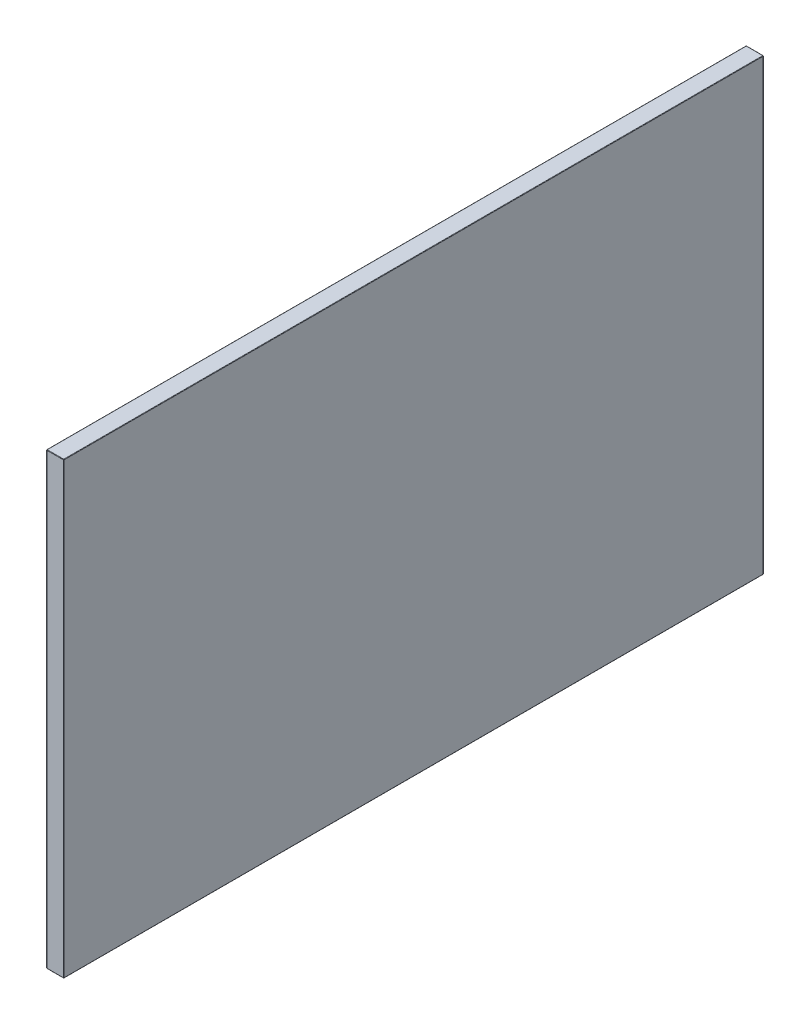
ISO-10303-21;
HEADER;
FILE_DESCRIPTION(('STEP AP214'),'2;1');
FILE_NAME('part.step','',(''),(''),'','','');
FILE_SCHEMA(('AUTOMOTIVE_DESIGN { 1 0 10303 214 1 1 1 1 }'));
ENDSEC;
DATA;
#1=APPLICATION_CONTEXT('core data for automotive mechanical design processes');
#2=APPLICATION_PROTOCOL_DEFINITION('international standard','automotive_design',2000,#1);
#3=PRODUCT_CONTEXT('',#1,'mechanical');
#4=PRODUCT('Part','Part','',(#3));
#5=PRODUCT_RELATED_PRODUCT_CATEGORY('part','',(#4));
#6=PRODUCT_DEFINITION_FORMATION('','',#4);
#7=PRODUCT_DEFINITION_CONTEXT('part definition',#1,'design');
#8=PRODUCT_DEFINITION('design','',#6,#7);
#9=PRODUCT_DEFINITION_SHAPE('','',#8);
#10=(LENGTH_UNIT() NAMED_UNIT(*) SI_UNIT(.MILLI.,.METRE.));
#11=(NAMED_UNIT(*) PLANE_ANGLE_UNIT() SI_UNIT($,.RADIAN.));
#12=(NAMED_UNIT(*) SI_UNIT($,.STERADIAN.) SOLID_ANGLE_UNIT());
#13=UNCERTAINTY_MEASURE_WITH_UNIT(LENGTH_MEASURE(1.E-05),#10,'distance_accuracy_value','');
#14=(GEOMETRIC_REPRESENTATION_CONTEXT(3) GLOBAL_UNCERTAINTY_ASSIGNED_CONTEXT((#13)) GLOBAL_UNIT_ASSIGNED_CONTEXT((#10,
#11,#12)) REPRESENTATION_CONTEXT('',''));
#15=CARTESIAN_POINT('',(0.,0.,0.));
#16=DIRECTION('',(0.,0.,1.));
#17=DIRECTION('',(1.,0.,0.));
#18=AXIS2_PLACEMENT_3D('',#15,#16,#17);
#19=CARTESIAN_POINT('',(20.,260.,405.));
#20=DIRECTION('',(0.,1.,0.));
#21=DIRECTION('',(0.,0.,1.));
#22=AXIS2_PLACEMENT_3D('',#19,#20,#21);
#23=PLANE('',#22);
#24=DIRECTION('',(0.,0.,-1.));
#25=VECTOR('',#24,1.);
#26=CARTESIAN_POINT('',(19.5,260.,-405.));
#27=LINE('',#26,#25);
#28=CARTESIAN_POINT('',(19.5,260.,404.5));
#29=VERTEX_POINT('',#28);
#30=CARTESIAN_POINT('',(19.5,260.,-404.5));
#31=VERTEX_POINT('',#30);
#32=EDGE_CURVE('E43',#29,#31,#27,.T.);
#33=ORIENTED_EDGE('',*,*,#32,.T.);
#34=DIRECTION('',(-1.,0.,0.));
#35=VECTOR('',#34,1.);
#36=CARTESIAN_POINT('',(20.,260.,-404.5));
#37=LINE('',#36,#35);
#38=CARTESIAN_POINT('',(0.5,260.,-404.5));
#39=VERTEX_POINT('',#38);
#40=EDGE_CURVE('E11',#31,#39,#37,.T.);
#41=ORIENTED_EDGE('',*,*,#40,.T.);
#42=DIRECTION('',(0.,0.,-1.));
#43=VECTOR('',#42,1.);
#44=CARTESIAN_POINT('',(0.5,260.,405.));
#45=LINE('',#44,#43);
#46=CARTESIAN_POINT('',(0.5,260.,404.5));
#47=VERTEX_POINT('',#46);
#48=EDGE_CURVE('E200',#39,#47,#45,.F.);
#49=ORIENTED_EDGE('',*,*,#48,.T.);
#50=DIRECTION('',(-1.,0.,0.));
#51=VECTOR('',#50,1.);
#52=CARTESIAN_POINT('',(20.,260.,404.5));
#53=LINE('',#52,#51);
#54=EDGE_CURVE('E54',#47,#29,#53,.F.);
#55=ORIENTED_EDGE('',*,*,#54,.T.);
#56=EDGE_LOOP('',(#33,#41,#49,#55));
#57=FACE_BOUND('',#56,.T.);
#58=ADVANCED_FACE('F34',(#57),#23,.T.);
#59=CARTESIAN_POINT('',(20.,260.,405.));
#60=DIRECTION('',(0.,0.,-1.));
#61=DIRECTION('',(-1.,0.,0.));
#62=AXIS2_PLACEMENT_3D('',#59,#60,#61);
#63=PLANE('',#62);
#64=DIRECTION('',(-1.,0.,0.));
#65=VECTOR('',#64,1.);
#66=CARTESIAN_POINT('',(20.,-259.5,405.));
#67=LINE('',#66,#65);
#68=CARTESIAN_POINT('',(0.5,-259.5,405.));
#69=VERTEX_POINT('',#68);
#70=CARTESIAN_POINT('',(19.5,-259.5,405.));
#71=VERTEX_POINT('',#70);
#72=EDGE_CURVE('E195',#69,#71,#67,.F.);
#73=ORIENTED_EDGE('',*,*,#72,.T.);
#74=DIRECTION('',(0.,-1.,0.));
#75=VECTOR('',#74,1.);
#76=CARTESIAN_POINT('',(19.5,260.,405.));
#77=LINE('',#76,#75);
#78=CARTESIAN_POINT('',(19.5,259.5,405.));
#79=VERTEX_POINT('',#78);
#80=EDGE_CURVE('E197',#71,#79,#77,.F.);
#81=ORIENTED_EDGE('',*,*,#80,.T.);
#82=DIRECTION('',(-1.,0.,0.));
#83=VECTOR('',#82,1.);
#84=CARTESIAN_POINT('',(0.,259.5,405.));
#85=LINE('',#84,#83);
#86=CARTESIAN_POINT('',(0.5,259.5,405.));
#87=VERTEX_POINT('',#86);
#88=EDGE_CURVE('E191',#79,#87,#85,.T.);
#89=ORIENTED_EDGE('',*,*,#88,.T.);
#90=DIRECTION('',(0.,-1.,0.));
#91=VECTOR('',#90,1.);
#92=CARTESIAN_POINT('',(0.5,-260.,405.));
#93=LINE('',#92,#91);
#94=EDGE_CURVE('E193',#87,#69,#93,.T.);
#95=ORIENTED_EDGE('',*,*,#94,.T.);
#96=EDGE_LOOP('',(#73,#81,#89,#95));
#97=FACE_BOUND('',#96,.T.);
#98=ADVANCED_FACE('F276',(#97),#63,.F.);
#99=CARTESIAN_POINT('',(20.,-260.,405.));
#100=DIRECTION('',(0.,1.,0.));
#101=DIRECTION('',(0.,0.,1.));
#102=AXIS2_PLACEMENT_3D('',#99,#100,#101);
#103=PLANE('',#102);
#104=DIRECTION('',(-1.,0.,0.));
#105=VECTOR('',#104,1.);
#106=CARTESIAN_POINT('',(20.,-260.,-404.5));
#107=LINE('',#106,#105);
#108=CARTESIAN_POINT('',(0.5,-260.,-404.5));
#109=VERTEX_POINT('',#108);
#110=CARTESIAN_POINT('',(19.5,-260.,-404.5));
#111=VERTEX_POINT('',#110);
#112=EDGE_CURVE('E186',#109,#111,#107,.F.);
#113=ORIENTED_EDGE('',*,*,#112,.T.);
#114=DIRECTION('',(0.,0.,-1.));
#115=VECTOR('',#114,1.);
#116=CARTESIAN_POINT('',(19.5,-260.,405.));
#117=LINE('',#116,#115);
#118=CARTESIAN_POINT('',(19.5,-260.,404.5));
#119=VERTEX_POINT('',#118);
#120=EDGE_CURVE('E188',#111,#119,#117,.F.);
#121=ORIENTED_EDGE('',*,*,#120,.T.);
#122=DIRECTION('',(-1.,0.,0.));
#123=VECTOR('',#122,1.);
#124=CARTESIAN_POINT('',(20.,-260.,404.5));
#125=LINE('',#124,#123);
#126=CARTESIAN_POINT('',(0.5,-260.,404.5));
#127=VERTEX_POINT('',#126);
#128=EDGE_CURVE('E182',#119,#127,#125,.T.);
#129=ORIENTED_EDGE('',*,*,#128,.T.);
#130=DIRECTION('',(0.,0.,-1.));
#131=VECTOR('',#130,1.);
#132=CARTESIAN_POINT('',(0.5,-260.,-405.));
#133=LINE('',#132,#131);
#134=EDGE_CURVE('E184',#127,#109,#133,.T.);
#135=ORIENTED_EDGE('',*,*,#134,.T.);
#136=EDGE_LOOP('',(#113,#121,#129,#135));
#137=FACE_BOUND('',#136,.T.);
#138=ADVANCED_FACE('F267',(#137),#103,.F.);
#139=CARTESIAN_POINT('',(20.,260.,-405.));
#140=DIRECTION('',(0.,0.,-1.));
#141=DIRECTION('',(-1.,0.,0.));
#142=AXIS2_PLACEMENT_3D('',#139,#140,#141);
#143=PLANE('',#142);
#144=DIRECTION('',(0.,-1.,0.));
#145=VECTOR('',#144,1.);
#146=CARTESIAN_POINT('',(19.5,-260.,-405.));
#147=LINE('',#146,#145);
#148=CARTESIAN_POINT('',(19.5,259.5,-405.));
#149=VERTEX_POINT('',#148);
#150=CARTESIAN_POINT('',(19.5,-259.5,-405.));
#151=VERTEX_POINT('',#150);
#152=EDGE_CURVE('E134',#149,#151,#147,.T.);
#153=ORIENTED_EDGE('',*,*,#152,.T.);
#154=DIRECTION('',(-1.,0.,0.));
#155=VECTOR('',#154,1.);
#156=CARTESIAN_POINT('',(0.,-259.5,-405.));
#157=LINE('',#156,#155);
#158=CARTESIAN_POINT('',(0.5,-259.5,-405.));
#159=VERTEX_POINT('',#158);
#160=EDGE_CURVE('E130',#151,#159,#157,.T.);
#161=ORIENTED_EDGE('',*,*,#160,.T.);
#162=DIRECTION('',(0.,-1.,0.));
#163=VECTOR('',#162,1.);
#164=CARTESIAN_POINT('',(0.5,260.,-405.));
#165=LINE('',#164,#163);
#166=CARTESIAN_POINT('',(0.5,259.5,-405.));
#167=VERTEX_POINT('',#166);
#168=EDGE_CURVE('E122',#159,#167,#165,.F.);
#169=ORIENTED_EDGE('',*,*,#168,.T.);
#170=DIRECTION('',(-1.,0.,0.));
#171=VECTOR('',#170,1.);
#172=CARTESIAN_POINT('',(20.,259.5,-405.));
#173=LINE('',#172,#171);
#174=EDGE_CURVE('E127',#167,#149,#173,.F.);
#175=ORIENTED_EDGE('',*,*,#174,.T.);
#176=EDGE_LOOP('',(#153,#161,#169,#175));
#177=FACE_BOUND('',#176,.T.);
#178=ADVANCED_FACE('F125',(#177),#143,.T.);
#179=CARTESIAN_POINT('',(20.,0.,0.));
#180=DIRECTION('',(-1.,0.,0.));
#181=DIRECTION('',(0.,0.,1.));
#182=AXIS2_PLACEMENT_3D('',#179,#180,#181);
#183=PLANE('',#182);
#184=DIRECTION('',(0.,0.,-1.));
#185=VECTOR('',#184,1.);
#186=CARTESIAN_POINT('',(20.,-259.5,0.));
#187=LINE('',#186,#185);
#188=CARTESIAN_POINT('',(20.,-259.5,404.5));
#189=VERTEX_POINT('',#188);
#190=CARTESIAN_POINT('',(20.,-259.5,-404.5));
#191=VERTEX_POINT('',#190);
#192=EDGE_CURVE('E170',#189,#191,#187,.T.);
#193=ORIENTED_EDGE('',*,*,#192,.T.);
#194=DIRECTION('',(0.,-1.,0.));
#195=VECTOR('',#194,1.);
#196=CARTESIAN_POINT('',(20.,260.,-404.5));
#197=LINE('',#196,#195);
#198=CARTESIAN_POINT('',(20.,259.5,-404.5));
#199=VERTEX_POINT('',#198);
#200=EDGE_CURVE('E172',#191,#199,#197,.F.);
#201=ORIENTED_EDGE('',*,*,#200,.T.);
#202=DIRECTION('',(0.,0.,-1.));
#203=VECTOR('',#202,1.);
#204=CARTESIAN_POINT('',(20.,259.5,405.));
#205=LINE('',#204,#203);
#206=CARTESIAN_POINT('',(20.,259.5,404.5));
#207=VERTEX_POINT('',#206);
#208=EDGE_CURVE('E166',#199,#207,#205,.F.);
#209=ORIENTED_EDGE('',*,*,#208,.T.);
#210=DIRECTION('',(0.,-1.,0.));
#211=VECTOR('',#210,1.);
#212=CARTESIAN_POINT('',(20.,0.,404.5));
#213=LINE('',#212,#211);
#214=EDGE_CURVE('E168',#207,#189,#213,.T.);
#215=ORIENTED_EDGE('',*,*,#214,.T.);
#216=EDGE_LOOP('',(#193,#201,#209,#215));
#217=FACE_BOUND('',#216,.T.);
#218=ADVANCED_FACE('F299',(#217),#183,.F.);
#219=CARTESIAN_POINT('',(0.,0.,0.));
#220=DIRECTION('',(-1.,0.,0.));
#221=DIRECTION('',(0.,0.,1.));
#222=AXIS2_PLACEMENT_3D('',#219,#220,#221);
#223=PLANE('',#222);
#224=DIRECTION('',(0.,0.,-1.));
#225=VECTOR('',#224,1.);
#226=CARTESIAN_POINT('',(0.,259.5,0.));
#227=LINE('',#226,#225);
#228=CARTESIAN_POINT('',(0.,259.5,404.5));
#229=VERTEX_POINT('',#228);
#230=CARTESIAN_POINT('',(0.,259.5,-404.5));
#231=VERTEX_POINT('',#230);
#232=EDGE_CURVE('E175',#229,#231,#227,.T.);
#233=ORIENTED_EDGE('',*,*,#232,.T.);
#234=DIRECTION('',(0.,-1.,0.));
#235=VECTOR('',#234,1.);
#236=CARTESIAN_POINT('',(0.,0.,-404.5));
#237=LINE('',#236,#235);
#238=CARTESIAN_POINT('',(0.,-259.5,-404.5));
#239=VERTEX_POINT('',#238);
#240=EDGE_CURVE('E142',#231,#239,#237,.T.);
#241=ORIENTED_EDGE('',*,*,#240,.T.);
#242=DIRECTION('',(0.,0.,-1.));
#243=VECTOR('',#242,1.);
#244=CARTESIAN_POINT('',(0.,-259.5,405.));
#245=LINE('',#244,#243);
#246=CARTESIAN_POINT('',(0.,-259.5,404.5));
#247=VERTEX_POINT('',#246);
#248=EDGE_CURVE('E179',#239,#247,#245,.F.);
#249=ORIENTED_EDGE('',*,*,#248,.T.);
#250=DIRECTION('',(0.,-1.,0.));
#251=VECTOR('',#250,1.);
#252=CARTESIAN_POINT('',(0.,260.,404.5));
#253=LINE('',#252,#251);
#254=EDGE_CURVE('E177',#247,#229,#253,.F.);
#255=ORIENTED_EDGE('',*,*,#254,.T.);
#256=EDGE_LOOP('',(#233,#241,#249,#255));
#257=FACE_BOUND('',#256,.T.);
#258=ADVANCED_FACE('F297',(#257),#223,.T.);
#259=CARTESIAN_POINT('',(0.5,260.,404.5));
#260=DIRECTION('',(0.,1.,0.));
#261=DIRECTION('',(0.,0.,1.));
#262=AXIS2_PLACEMENT_3D('',#259,#260,#261);
#263=CYLINDRICAL_SURFACE('',#262,0.5);
#264=CARTESIAN_POINT('',(0.5,259.5,404.5));
#265=DIRECTION('',(0.,1.,0.));
#266=DIRECTION('',(0.,0.,1.));
#267=AXIS2_PLACEMENT_3D('',#264,#265,#266);
#268=CIRCLE('',#267,0.5);
#269=EDGE_CURVE('E38',#229,#87,#268,.T.);
#270=ORIENTED_EDGE('',*,*,#269,.F.);
#271=ORIENTED_EDGE('',*,*,#254,.F.);
#272=CARTESIAN_POINT('',(0.5,-259.5,404.5));
#273=DIRECTION('',(0.,-1.,0.));
#274=DIRECTION('',(0.,0.,-1.));
#275=AXIS2_PLACEMENT_3D('',#272,#273,#274);
#276=CIRCLE('',#275,0.5);
#277=EDGE_CURVE('E162',#69,#247,#276,.T.);
#278=ORIENTED_EDGE('',*,*,#277,.F.);
#279=ORIENTED_EDGE('',*,*,#94,.F.);
#280=EDGE_LOOP('',(#270,#271,#278,#279));
#281=FACE_BOUND('',#280,.T.);
#282=ADVANCED_FACE('F36',(#281),#263,.T.);
#283=CARTESIAN_POINT('',(0.5,259.5,404.5));
#284=DIRECTION('',(0.,0.,1.));
#285=DIRECTION('',(1.,0.,0.));
#286=AXIS2_PLACEMENT_3D('',#283,#284,#285);
#287=SPHERICAL_SURFACE('',#286,0.5);
#288=CARTESIAN_POINT('',(0.5,259.5,404.5));
#289=DIRECTION('',(0.,0.,1.));
#290=DIRECTION('',(1.,0.,0.));
#291=AXIS2_PLACEMENT_3D('',#288,#289,#290);
#292=CIRCLE('',#291,0.5);
#293=EDGE_CURVE('E245',#229,#47,#292,.F.);
#294=ORIENTED_EDGE('',*,*,#293,.F.);
#295=ORIENTED_EDGE('',*,*,#269,.T.);
#296=CARTESIAN_POINT('',(0.5,259.5,404.5));
#297=DIRECTION('',(-1.,0.,0.));
#298=DIRECTION('',(0.,-1.,0.));
#299=AXIS2_PLACEMENT_3D('',#296,#297,#298);
#300=CIRCLE('',#299,0.5);
#301=EDGE_CURVE('E248',#47,#87,#300,.F.);
#302=ORIENTED_EDGE('',*,*,#301,.F.);
#303=EDGE_LOOP('',(#294,#295,#302));
#304=FACE_BOUND('',#303,.T.);
#305=ADVANCED_FACE('F292',(#304),#287,.T.);
#306=CARTESIAN_POINT('',(0.5,-259.5,404.5));
#307=DIRECTION('',(-1.,0.,0.));
#308=DIRECTION('',(0.,0.,1.));
#309=AXIS2_PLACEMENT_3D('',#306,#307,#308);
#310=SPHERICAL_SURFACE('',#309,0.5);
#311=CARTESIAN_POINT('',(0.5,-259.5,404.5));
#312=DIRECTION('',(-1.,0.,0.));
#313=DIRECTION('',(0.,0.,1.));
#314=AXIS2_PLACEMENT_3D('',#311,#312,#313);
#315=CIRCLE('',#314,0.5);
#316=EDGE_CURVE('E239',#69,#127,#315,.F.);
#317=ORIENTED_EDGE('',*,*,#316,.F.);
#318=ORIENTED_EDGE('',*,*,#277,.T.);
#319=CARTESIAN_POINT('',(0.5,-259.5,404.5));
#320=DIRECTION('',(0.,0.,1.));
#321=DIRECTION('',(1.,0.,0.));
#322=AXIS2_PLACEMENT_3D('',#319,#320,#321);
#323=CIRCLE('',#322,0.5);
#324=EDGE_CURVE('E242',#127,#247,#323,.F.);
#325=ORIENTED_EDGE('',*,*,#324,.F.);
#326=EDGE_LOOP('',(#317,#318,#325));
#327=FACE_BOUND('',#326,.T.);
#328=ADVANCED_FACE('F255',(#327),#310,.T.);
#329=CARTESIAN_POINT('',(20.,259.5,404.5));
#330=DIRECTION('',(1.,0.,0.));
#331=DIRECTION('',(0.,0.,-1.));
#332=AXIS2_PLACEMENT_3D('',#329,#330,#331);
#333=CYLINDRICAL_SURFACE('',#332,0.5);
#334=ORIENTED_EDGE('',*,*,#301,.T.);
#335=ORIENTED_EDGE('',*,*,#88,.F.);
#336=CARTESIAN_POINT('',(19.5,259.5,404.5));
#337=DIRECTION('',(1.,0.,0.));
#338=DIRECTION('',(0.,0.,-1.));
#339=AXIS2_PLACEMENT_3D('',#336,#337,#338);
#340=CIRCLE('',#339,0.5);
#341=EDGE_CURVE('E234',#29,#79,#340,.T.);
#342=ORIENTED_EDGE('',*,*,#341,.F.);
#343=ORIENTED_EDGE('',*,*,#54,.F.);
#344=EDGE_LOOP('',(#334,#335,#342,#343));
#345=FACE_BOUND('',#344,.T.);
#346=ADVANCED_FACE('F287',(#345),#333,.T.);
#347=CARTESIAN_POINT('',(0.5,259.5,0.));
#348=DIRECTION('',(0.,0.,-1.));
#349=DIRECTION('',(-1.,0.,0.));
#350=AXIS2_PLACEMENT_3D('',#347,#348,#349);
#351=CYLINDRICAL_SURFACE('',#350,0.5);
#352=ORIENTED_EDGE('',*,*,#293,.T.);
#353=ORIENTED_EDGE('',*,*,#48,.F.);
#354=CARTESIAN_POINT('',(0.5,259.5,-404.5));
#355=DIRECTION('',(0.,-1.11022302462516E-13,-1.));
#356=DIRECTION('',(0.,1.,-1.11022302462516E-13));
#357=AXIS2_PLACEMENT_3D('',#354,#355,#356);
#358=CIRCLE('',#357,0.5);
#359=EDGE_CURVE('E146',#231,#39,#358,.T.);
#360=ORIENTED_EDGE('',*,*,#359,.F.);
#361=ORIENTED_EDGE('',*,*,#232,.F.);
#362=EDGE_LOOP('',(#352,#353,#360,#361));
#363=FACE_BOUND('',#362,.T.);
#364=ADVANCED_FACE('F295',(#363),#351,.T.);
#365=CARTESIAN_POINT('',(0.5,0.,-404.5));
#366=DIRECTION('',(0.,-1.,0.));
#367=DIRECTION('',(0.,0.,-1.));
#368=AXIS2_PLACEMENT_3D('',#365,#366,#367);
#369=CYLINDRICAL_SURFACE('',#368,0.5);
#370=CARTESIAN_POINT('',(0.5,-259.5,-404.5));
#371=DIRECTION('',(0.,-1.,1.11022302462516E-13));
#372=DIRECTION('',(0.,-1.11022302462516E-13,-1.));
#373=AXIS2_PLACEMENT_3D('',#370,#371,#372);
#374=CIRCLE('',#373,0.5);
#375=EDGE_CURVE('E147',#239,#159,#374,.T.);
#376=ORIENTED_EDGE('',*,*,#375,.F.);
#377=ORIENTED_EDGE('',*,*,#240,.F.);
#378=CARTESIAN_POINT('',(0.5,259.5,-404.5));
#379=DIRECTION('',(0.,1.,0.));
#380=DIRECTION('',(0.,0.,1.));
#381=AXIS2_PLACEMENT_3D('',#378,#379,#380);
#382=CIRCLE('',#381,0.5);
#383=EDGE_CURVE('E138',#167,#231,#382,.T.);
#384=ORIENTED_EDGE('',*,*,#383,.F.);
#385=ORIENTED_EDGE('',*,*,#168,.F.);
#386=EDGE_LOOP('',(#376,#377,#384,#385));
#387=FACE_BOUND('',#386,.T.);
#388=ADVANCED_FACE('F140',(#387),#369,.T.);
#389=CARTESIAN_POINT('',(0.5,-259.5,405.));
#390=DIRECTION('',(0.,0.,1.));
#391=DIRECTION('',(1.,0.,0.));
#392=AXIS2_PLACEMENT_3D('',#389,#390,#391);
#393=CYLINDRICAL_SURFACE('',#392,0.5);
#394=ORIENTED_EDGE('',*,*,#324,.T.);
#395=ORIENTED_EDGE('',*,*,#248,.F.);
#396=CARTESIAN_POINT('',(0.5,-259.5,-404.5));
#397=DIRECTION('',(0.,0.,-1.));
#398=DIRECTION('',(-1.,0.,0.));
#399=AXIS2_PLACEMENT_3D('',#396,#397,#398);
#400=CIRCLE('',#399,0.5);
#401=EDGE_CURVE('E230',#109,#239,#400,.T.);
#402=ORIENTED_EDGE('',*,*,#401,.F.);
#403=ORIENTED_EDGE('',*,*,#134,.F.);
#404=EDGE_LOOP('',(#394,#395,#402,#403));
#405=FACE_BOUND('',#404,.T.);
#406=ADVANCED_FACE('F263',(#405),#393,.T.);
#407=CARTESIAN_POINT('',(20.,-259.5,404.5));
#408=DIRECTION('',(-1.,0.,0.));
#409=DIRECTION('',(0.,0.,1.));
#410=AXIS2_PLACEMENT_3D('',#407,#408,#409);
#411=CYLINDRICAL_SURFACE('',#410,0.5);
#412=ORIENTED_EDGE('',*,*,#316,.T.);
#413=ORIENTED_EDGE('',*,*,#128,.F.);
#414=CARTESIAN_POINT('',(19.5,-259.5,404.5));
#415=DIRECTION('',(1.,0.,0.));
#416=DIRECTION('',(0.,0.,-1.));
#417=AXIS2_PLACEMENT_3D('',#414,#415,#416);
#418=CIRCLE('',#417,0.5);
#419=EDGE_CURVE('E227',#71,#119,#418,.T.);
#420=ORIENTED_EDGE('',*,*,#419,.F.);
#421=ORIENTED_EDGE('',*,*,#72,.F.);
#422=EDGE_LOOP('',(#412,#413,#420,#421));
#423=FACE_BOUND('',#422,.T.);
#424=ADVANCED_FACE('F273',(#423),#411,.T.);
#425=CARTESIAN_POINT('',(19.5,0.,404.5));
#426=DIRECTION('',(0.,-1.,0.));
#427=DIRECTION('',(0.,0.,-1.));
#428=AXIS2_PLACEMENT_3D('',#425,#426,#427);
#429=CYLINDRICAL_SURFACE('',#428,0.5);
#430=CARTESIAN_POINT('',(19.5,259.5,404.5));
#431=DIRECTION('',(0.,1.,0.));
#432=DIRECTION('',(0.,0.,1.));
#433=AXIS2_PLACEMENT_3D('',#430,#431,#432);
#434=CIRCLE('',#433,0.5);
#435=EDGE_CURVE('E236',#79,#207,#434,.T.);
#436=ORIENTED_EDGE('',*,*,#435,.F.);
#437=ORIENTED_EDGE('',*,*,#80,.F.);
#438=CARTESIAN_POINT('',(19.5,-259.5,404.5));
#439=DIRECTION('',(0.,-1.,0.));
#440=DIRECTION('',(0.,0.,-1.));
#441=AXIS2_PLACEMENT_3D('',#438,#439,#440);
#442=CIRCLE('',#441,0.5);
#443=EDGE_CURVE('E224',#189,#71,#442,.T.);
#444=ORIENTED_EDGE('',*,*,#443,.F.);
#445=ORIENTED_EDGE('',*,*,#214,.F.);
#446=EDGE_LOOP('',(#436,#437,#444,#445));
#447=FACE_BOUND('',#446,.T.);
#448=ADVANCED_FACE('F280',(#447),#429,.T.);
#449=CARTESIAN_POINT('',(19.5,259.5,404.5));
#450=DIRECTION('',(0.,0.,1.));
#451=DIRECTION('',(1.,0.,0.));
#452=AXIS2_PLACEMENT_3D('',#449,#450,#451);
#453=SPHERICAL_SURFACE('',#452,0.5);
#454=ORIENTED_EDGE('',*,*,#341,.T.);
#455=ORIENTED_EDGE('',*,*,#435,.T.);
#456=CARTESIAN_POINT('',(19.5,259.5,404.5));
#457=DIRECTION('',(0.,0.,1.));
#458=DIRECTION('',(1.,0.,0.));
#459=AXIS2_PLACEMENT_3D('',#456,#457,#458);
#460=CIRCLE('',#459,0.5);
#461=EDGE_CURVE('E153',#29,#207,#460,.F.);
#462=ORIENTED_EDGE('',*,*,#461,.F.);
#463=EDGE_LOOP('',(#454,#455,#462));
#464=FACE_BOUND('',#463,.T.);
#465=ADVANCED_FACE('F352',(#464),#453,.T.);
#466=CARTESIAN_POINT('',(0.5,259.5,-404.5));
#467=DIRECTION('',(-1.,0.,0.));
#468=DIRECTION('',(0.,0.,1.));
#469=AXIS2_PLACEMENT_3D('',#466,#467,#468);
#470=SPHERICAL_SURFACE('',#469,0.5);
#471=ORIENTED_EDGE('',*,*,#383,.T.);
#472=ORIENTED_EDGE('',*,*,#359,.T.);
#473=CARTESIAN_POINT('',(0.5,259.5,-404.5));
#474=DIRECTION('',(-1.,0.,0.));
#475=DIRECTION('',(0.,0.,1.));
#476=AXIS2_PLACEMENT_3D('',#473,#474,#475);
#477=CIRCLE('',#476,0.5);
#478=EDGE_CURVE('E149',#167,#39,#477,.F.);
#479=ORIENTED_EDGE('',*,*,#478,.F.);
#480=EDGE_LOOP('',(#471,#472,#479));
#481=FACE_BOUND('',#480,.T.);
#482=ADVANCED_FACE('F150',(#481),#470,.T.);
#483=CARTESIAN_POINT('',(0.5,-259.5,-404.5));
#484=DIRECTION('',(-1.,0.,0.));
#485=DIRECTION('',(0.,0.,1.));
#486=AXIS2_PLACEMENT_3D('',#483,#484,#485);
#487=SPHERICAL_SURFACE('',#486,0.5);
#488=ORIENTED_EDGE('',*,*,#401,.T.);
#489=ORIENTED_EDGE('',*,*,#375,.T.);
#490=CARTESIAN_POINT('',(0.5,-259.5,-404.5));
#491=DIRECTION('',(-1.,0.,0.));
#492=DIRECTION('',(0.,-1.,0.));
#493=AXIS2_PLACEMENT_3D('',#490,#491,#492);
#494=CIRCLE('',#493,0.5);
#495=EDGE_CURVE('E154',#109,#159,#494,.F.);
#496=ORIENTED_EDGE('',*,*,#495,.F.);
#497=EDGE_LOOP('',(#488,#489,#496));
#498=FACE_BOUND('',#497,.T.);
#499=ADVANCED_FACE('F345',(#498),#487,.T.);
#500=CARTESIAN_POINT('',(19.5,-259.5,404.5));
#501=DIRECTION('',(0.,0.,1.));
#502=DIRECTION('',(1.,0.,0.));
#503=AXIS2_PLACEMENT_3D('',#500,#501,#502);
#504=SPHERICAL_SURFACE('',#503,0.5);
#505=ORIENTED_EDGE('',*,*,#443,.T.);
#506=ORIENTED_EDGE('',*,*,#419,.T.);
#507=CARTESIAN_POINT('',(19.5,-259.5,404.5));
#508=DIRECTION('',(0.,0.,1.));
#509=DIRECTION('',(1.,0.,0.));
#510=AXIS2_PLACEMENT_3D('',#507,#508,#509);
#511=CIRCLE('',#510,0.5);
#512=EDGE_CURVE('E218',#189,#119,#511,.F.);
#513=ORIENTED_EDGE('',*,*,#512,.F.);
#514=EDGE_LOOP('',(#505,#506,#513));
#515=FACE_BOUND('',#514,.T.);
#516=ADVANCED_FACE('F341',(#515),#504,.T.);
#517=CARTESIAN_POINT('',(19.5,259.5,405.));
#518=DIRECTION('',(0.,0.,1.));
#519=DIRECTION('',(1.,0.,0.));
#520=AXIS2_PLACEMENT_3D('',#517,#518,#519);
#521=CYLINDRICAL_SURFACE('',#520,0.5);
#522=ORIENTED_EDGE('',*,*,#461,.T.);
#523=ORIENTED_EDGE('',*,*,#208,.F.);
#524=CARTESIAN_POINT('',(19.5,259.5,-404.5));
#525=DIRECTION('',(1.11022302462516E-13,0.,-1.));
#526=DIRECTION('',(-1.,0.,-1.11022302462516E-13));
#527=AXIS2_PLACEMENT_3D('',#524,#525,#526);
#528=CIRCLE('',#527,0.5);
#529=EDGE_CURVE('E215',#31,#199,#528,.T.);
#530=ORIENTED_EDGE('',*,*,#529,.F.);
#531=ORIENTED_EDGE('',*,*,#32,.F.);
#532=EDGE_LOOP('',(#522,#523,#530,#531));
#533=FACE_BOUND('',#532,.T.);
#534=ADVANCED_FACE('F338',(#533),#521,.T.);
#535=CARTESIAN_POINT('',(20.,259.5,-404.5));
#536=DIRECTION('',(-1.,0.,0.));
#537=DIRECTION('',(0.,0.,1.));
#538=AXIS2_PLACEMENT_3D('',#535,#536,#537);
#539=CYLINDRICAL_SURFACE('',#538,0.5);
#540=ORIENTED_EDGE('',*,*,#478,.T.);
#541=ORIENTED_EDGE('',*,*,#40,.F.);
#542=CARTESIAN_POINT('',(19.5,259.5,-404.5));
#543=DIRECTION('',(1.,0.,0.));
#544=DIRECTION('',(0.,0.,-1.));
#545=AXIS2_PLACEMENT_3D('',#542,#543,#544);
#546=CIRCLE('',#545,0.5);
#547=EDGE_CURVE('E158',#149,#31,#546,.T.);
#548=ORIENTED_EDGE('',*,*,#547,.F.);
#549=ORIENTED_EDGE('',*,*,#174,.F.);
#550=EDGE_LOOP('',(#540,#541,#548,#549));
#551=FACE_BOUND('',#550,.T.);
#552=ADVANCED_FACE('F156',(#551),#539,.T.);
#553=CARTESIAN_POINT('',(20.,-259.5,-404.5));
#554=DIRECTION('',(1.,0.,0.));
#555=DIRECTION('',(0.,0.,-1.));
#556=AXIS2_PLACEMENT_3D('',#553,#554,#555);
#557=CYLINDRICAL_SURFACE('',#556,0.5);
#558=ORIENTED_EDGE('',*,*,#495,.T.);
#559=ORIENTED_EDGE('',*,*,#160,.F.);
#560=CARTESIAN_POINT('',(19.5,-259.5,-404.5));
#561=DIRECTION('',(1.,0.,0.));
#562=DIRECTION('',(0.,0.,-1.));
#563=AXIS2_PLACEMENT_3D('',#560,#561,#562);
#564=CIRCLE('',#563,0.5);
#565=EDGE_CURVE('E211',#111,#151,#564,.T.);
#566=ORIENTED_EDGE('',*,*,#565,.F.);
#567=ORIENTED_EDGE('',*,*,#112,.F.);
#568=EDGE_LOOP('',(#558,#559,#566,#567));
#569=FACE_BOUND('',#568,.T.);
#570=ADVANCED_FACE('F331',(#569),#557,.T.);
#571=CARTESIAN_POINT('',(19.5,-259.5,0.));
#572=DIRECTION('',(0.,0.,-1.));
#573=DIRECTION('',(-1.,0.,0.));
#574=AXIS2_PLACEMENT_3D('',#571,#572,#573);
#575=CYLINDRICAL_SURFACE('',#574,0.5);
#576=ORIENTED_EDGE('',*,*,#512,.T.);
#577=ORIENTED_EDGE('',*,*,#120,.F.);
#578=CARTESIAN_POINT('',(19.5,-259.5,-404.5));
#579=DIRECTION('',(0.,0.,-1.));
#580=DIRECTION('',(-1.,0.,0.));
#581=AXIS2_PLACEMENT_3D('',#578,#579,#580);
#582=CIRCLE('',#581,0.5);
#583=EDGE_CURVE('E208',#191,#111,#582,.T.);
#584=ORIENTED_EDGE('',*,*,#583,.F.);
#585=ORIENTED_EDGE('',*,*,#192,.F.);
#586=EDGE_LOOP('',(#576,#577,#584,#585));
#587=FACE_BOUND('',#586,.T.);
#588=ADVANCED_FACE('F327',(#587),#575,.T.);
#589=CARTESIAN_POINT('',(19.5,259.5,-404.5));
#590=DIRECTION('',(0.,1.,-1.11022302462516E-13));
#591=DIRECTION('',(0.,1.11022302462516E-13,1.));
#592=AXIS2_PLACEMENT_3D('',#589,#590,#591);
#593=SPHERICAL_SURFACE('',#592,0.5);
#594=ORIENTED_EDGE('',*,*,#547,.T.);
#595=ORIENTED_EDGE('',*,*,#529,.T.);
#596=CARTESIAN_POINT('',(19.5,259.5,-404.5));
#597=DIRECTION('',(0.,1.,0.));
#598=DIRECTION('',(0.,0.,1.));
#599=AXIS2_PLACEMENT_3D('',#596,#597,#598);
#600=CIRCLE('',#599,0.5);
#601=EDGE_CURVE('E206',#149,#199,#600,.F.);
#602=ORIENTED_EDGE('',*,*,#601,.F.);
#603=EDGE_LOOP('',(#594,#595,#602));
#604=FACE_BOUND('',#603,.T.);
#605=ADVANCED_FACE('F323',(#604),#593,.T.);
#606=CARTESIAN_POINT('',(19.5,-259.5,-404.5));
#607=DIRECTION('',(0.,-1.,0.));
#608=DIRECTION('',(0.,0.,-1.));
#609=AXIS2_PLACEMENT_3D('',#606,#607,#608);
#610=SPHERICAL_SURFACE('',#609,0.5);
#611=ORIENTED_EDGE('',*,*,#583,.T.);
#612=ORIENTED_EDGE('',*,*,#565,.T.);
#613=CARTESIAN_POINT('',(19.5,-259.5,-404.5));
#614=DIRECTION('',(1.11022302462516E-13,-1.,0.));
#615=DIRECTION('',(1.,1.11022302462516E-13,0.));
#616=AXIS2_PLACEMENT_3D('',#613,#614,#615);
#617=CIRCLE('',#616,0.5);
#618=EDGE_CURVE('E204',#191,#151,#617,.F.);
#619=ORIENTED_EDGE('',*,*,#618,.F.);
#620=EDGE_LOOP('',(#611,#612,#619));
#621=FACE_BOUND('',#620,.T.);
#622=ADVANCED_FACE('F319',(#621),#610,.T.);
#623=CARTESIAN_POINT('',(19.5,260.,-404.5));
#624=DIRECTION('',(0.,1.,0.));
#625=DIRECTION('',(0.,0.,1.));
#626=AXIS2_PLACEMENT_3D('',#623,#624,#625);
#627=CYLINDRICAL_SURFACE('',#626,0.5);
#628=ORIENTED_EDGE('',*,*,#601,.T.);
#629=ORIENTED_EDGE('',*,*,#200,.F.);
#630=ORIENTED_EDGE('',*,*,#618,.T.);
#631=ORIENTED_EDGE('',*,*,#152,.F.);
#632=EDGE_LOOP('',(#628,#629,#630,#631));
#633=FACE_BOUND('',#632,.T.);
#634=ADVANCED_FACE('F316',(#633),#627,.T.);
#635=CLOSED_SHELL('',(#58,#98,#138,#178,#218,#258,#282,#305,#328,#346,#364,#388,#406,#424,#448,
#465,#482,#499,#516,#534,#552,#570,#588,#605,#622,#634));
#636=MANIFOLD_SOLID_BREP('B2',#635);
#637=ADVANCED_BREP_SHAPE_REPRESENTATION('',(#18,#636),#14);
#638=SHAPE_DEFINITION_REPRESENTATION(#9,#637);
ENDSEC;
END-ISO-10303-21;
